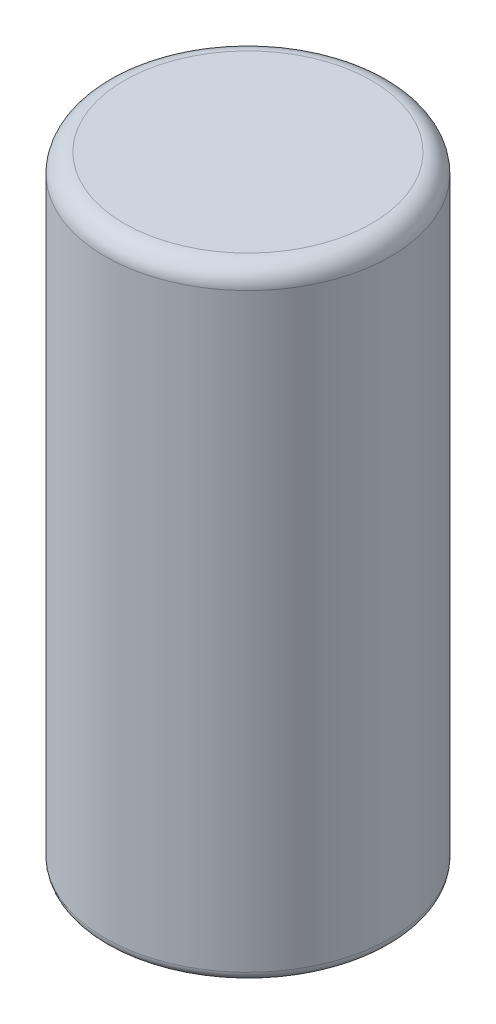
ISO-10303-21;
HEADER;
FILE_DESCRIPTION(('STEP AP214'),'2;1');
FILE_NAME('part.step','',(''),(''),'','','');
FILE_SCHEMA(('AUTOMOTIVE_DESIGN { 1 0 10303 214 1 1 1 1 }'));
ENDSEC;
DATA;
#1=APPLICATION_CONTEXT('core data for automotive mechanical design processes');
#2=APPLICATION_PROTOCOL_DEFINITION('international standard','automotive_design',2000,#1);
#3=PRODUCT_CONTEXT('',#1,'mechanical');
#4=PRODUCT('Part','Part','',(#3));
#5=PRODUCT_RELATED_PRODUCT_CATEGORY('part','',(#4));
#6=PRODUCT_DEFINITION_FORMATION('','',#4);
#7=PRODUCT_DEFINITION_CONTEXT('part definition',#1,'design');
#8=PRODUCT_DEFINITION('design','',#6,#7);
#9=PRODUCT_DEFINITION_SHAPE('','',#8);
#10=(LENGTH_UNIT() NAMED_UNIT(*) SI_UNIT(.MILLI.,.METRE.));
#11=(NAMED_UNIT(*) PLANE_ANGLE_UNIT() SI_UNIT($,.RADIAN.));
#12=(NAMED_UNIT(*) SI_UNIT($,.STERADIAN.) SOLID_ANGLE_UNIT());
#13=UNCERTAINTY_MEASURE_WITH_UNIT(LENGTH_MEASURE(1.E-05),#10,'distance_accuracy_value','');
#14=(GEOMETRIC_REPRESENTATION_CONTEXT(3) GLOBAL_UNCERTAINTY_ASSIGNED_CONTEXT((#13)) GLOBAL_UNIT_ASSIGNED_CONTEXT((#10,
#11,#12)) REPRESENTATION_CONTEXT('',''));
#15=CARTESIAN_POINT('',(0.,0.,0.));
#16=DIRECTION('',(0.,0.,1.));
#17=DIRECTION('',(1.,0.,0.));
#18=AXIS2_PLACEMENT_3D('',#15,#16,#17);
#19=CARTESIAN_POINT('',(0.,65.,0.));
#20=DIRECTION('',(0.,-1.,0.));
#21=DIRECTION('',(0.,0.,-1.));
#22=AXIS2_PLACEMENT_3D('',#19,#20,#21);
#23=CYLINDRICAL_SURFACE('',#22,15.);
#24=CARTESIAN_POINT('',(0.,1.,0.));
#25=DIRECTION('',(0.,1.,0.));
#26=DIRECTION('',(0.,0.,1.));
#27=AXIS2_PLACEMENT_3D('',#24,#25,#26);
#28=CIRCLE('',#27,15.);
#29=CARTESIAN_POINT('',(0.,1.,15.));
#30=VERTEX_POINT('',#29);
#31=EDGE_CURVE('E46',#30,#30,#28,.T.);
#32=ORIENTED_EDGE('',*,*,#31,.T.);
#33=EDGE_LOOP('',(#32));
#34=FACE_BOUND('',#33,.T.);
#35=CARTESIAN_POINT('',(0.,63.,0.));
#36=DIRECTION('',(0.,1.,0.));
#37=DIRECTION('',(0.,0.,1.));
#38=AXIS2_PLACEMENT_3D('',#35,#36,#37);
#39=CIRCLE('',#38,15.);
#40=CARTESIAN_POINT('',(0.,63.,15.));
#41=VERTEX_POINT('',#40);
#42=EDGE_CURVE('E51',#41,#41,#39,.F.);
#43=ORIENTED_EDGE('',*,*,#42,.T.);
#44=EDGE_LOOP('',(#43));
#45=FACE_BOUND('',#44,.T.);
#46=ADVANCED_FACE('F31',(#34,#45),#23,.T.);
#47=CARTESIAN_POINT('',(0.,65.,0.));
#48=DIRECTION('',(0.,1.,0.));
#49=DIRECTION('',(0.,0.,1.));
#50=AXIS2_PLACEMENT_3D('',#47,#48,#49);
#51=PLANE('',#50);
#52=CARTESIAN_POINT('',(0.,65.,0.));
#53=DIRECTION('',(0.,1.,0.));
#54=DIRECTION('',(0.,0.,1.));
#55=AXIS2_PLACEMENT_3D('',#52,#53,#54);
#56=CIRCLE('',#55,13.);
#57=CARTESIAN_POINT('',(0.,65.,13.));
#58=VERTEX_POINT('',#57);
#59=EDGE_CURVE('E54',#58,#58,#56,.T.);
#60=ORIENTED_EDGE('',*,*,#59,.T.);
#61=EDGE_LOOP('',(#60));
#62=FACE_BOUND('',#61,.T.);
#63=ADVANCED_FACE('F79',(#62),#51,.T.);
#64=CARTESIAN_POINT('',(0.,0.,0.));
#65=DIRECTION('',(0.,1.,0.));
#66=DIRECTION('',(0.,0.,1.));
#67=AXIS2_PLACEMENT_3D('',#64,#65,#66);
#68=PLANE('',#67);
#69=CARTESIAN_POINT('',(6.,0.,0.));
#70=DIRECTION('',(0.,1.,0.));
#71=DIRECTION('',(0.,0.,1.));
#72=AXIS2_PLACEMENT_3D('',#69,#70,#71);
#73=CIRCLE('',#72,2.);
#74=CARTESIAN_POINT('',(6.,0.,-2.));
#75=VERTEX_POINT('',#74);
#76=EDGE_CURVE('E10',#75,#75,#73,.F.);
#77=ORIENTED_EDGE('',*,*,#76,.F.);
#78=EDGE_LOOP('',(#77));
#79=FACE_BOUND('',#78,.T.);
#80=CARTESIAN_POINT('',(-6.,0.,0.));
#81=DIRECTION('',(0.,1.,0.));
#82=DIRECTION('',(0.,0.,1.));
#83=AXIS2_PLACEMENT_3D('',#80,#81,#82);
#84=CIRCLE('',#83,2.);
#85=CARTESIAN_POINT('',(-6.,0.,-2.));
#86=VERTEX_POINT('',#85);
#87=EDGE_CURVE('E38',#86,#86,#84,.F.);
#88=ORIENTED_EDGE('',*,*,#87,.F.);
#89=EDGE_LOOP('',(#88));
#90=FACE_BOUND('',#89,.T.);
#91=CARTESIAN_POINT('',(0.,0.,0.));
#92=DIRECTION('',(0.,1.,0.));
#93=DIRECTION('',(0.,0.,1.));
#94=AXIS2_PLACEMENT_3D('',#91,#92,#93);
#95=CIRCLE('',#94,14.);
#96=CARTESIAN_POINT('',(0.,0.,14.));
#97=VERTEX_POINT('',#96);
#98=EDGE_CURVE('E42',#97,#97,#95,.F.);
#99=ORIENTED_EDGE('',*,*,#98,.T.);
#100=EDGE_LOOP('',(#99));
#101=FACE_BOUND('',#100,.T.);
#102=ADVANCED_FACE('F85',(#79,#90,#101),#68,.F.);
#103=CARTESIAN_POINT('',(0.,63.,0.));
#104=DIRECTION('',(0.,1.,0.));
#105=DIRECTION('',(0.,0.,1.));
#106=AXIS2_PLACEMENT_3D('',#103,#104,#105);
#107=TOROIDAL_SURFACE('',#106,13.,2.);
#108=ORIENTED_EDGE('',*,*,#42,.F.);
#109=EDGE_LOOP('',(#108));
#110=FACE_BOUND('',#109,.T.);
#111=ORIENTED_EDGE('',*,*,#59,.F.);
#112=EDGE_LOOP('',(#111));
#113=FACE_BOUND('',#112,.T.);
#114=ADVANCED_FACE('F90',(#110,#113),#107,.T.);
#115=CARTESIAN_POINT('',(0.,1.,0.));
#116=DIRECTION('',(0.,1.,0.));
#117=DIRECTION('',(0.,0.,1.));
#118=AXIS2_PLACEMENT_3D('',#115,#116,#117);
#119=TOROIDAL_SURFACE('',#118,14.,1.);
#120=ORIENTED_EDGE('',*,*,#98,.F.);
#121=EDGE_LOOP('',(#120));
#122=FACE_BOUND('',#121,.T.);
#123=ORIENTED_EDGE('',*,*,#31,.F.);
#124=EDGE_LOOP('',(#123));
#125=FACE_BOUND('',#124,.T.);
#126=ADVANCED_FACE('F33',(#122,#125),#119,.T.);
#127=CARTESIAN_POINT('',(-6.,0.,0.));
#128=DIRECTION('',(0.,1.,0.));
#129=DIRECTION('',(0.,0.,-1.));
#130=AXIS2_PLACEMENT_3D('',#127,#128,#129);
#131=CONICAL_SURFACE('',#130,2.,0.279252680319093);
#132=CARTESIAN_POINT('',(-6.,-5.,0.));
#133=DIRECTION('',(0.,-1.,0.));
#134=DIRECTION('',(0.,0.,-1.));
#135=AXIS2_PLACEMENT_3D('',#132,#133,#134);
#136=CIRCLE('',#135,0.56627307120596);
#137=CARTESIAN_POINT('',(-6.,-5.,-0.56627307120596));
#138=VERTEX_POINT('',#137);
#139=EDGE_CURVE('E57',#138,#138,#136,.T.);
#140=CARTESIAN_POINT('',(-6.,-5.,-0.56627307120596));
#141=CARTESIAN_POINT('',(-6.,-4.94791666666667,-0.581207726714231));
#142=CARTESIAN_POINT('',(-6.,-4.89583333333333,-0.596142382222503));
#143=CARTESIAN_POINT('',(-6.,-4.79166666666667,-0.626011693239045));
#144=CARTESIAN_POINT('',(-6.,-4.73958333333333,-0.640946348747316));
#145=CARTESIAN_POINT('',(-6.,-4.63541666666667,-0.670815659763859));
#146=CARTESIAN_POINT('',(-6.,-4.58333333333333,-0.68575031527213));
#147=CARTESIAN_POINT('',(-6.,-4.47916666666667,-0.715619626288672));
#148=CARTESIAN_POINT('',(-6.,-4.42708333333333,-0.730554281796944));
#149=CARTESIAN_POINT('',(-6.,-4.32291666666667,-0.760423592813486));
#150=CARTESIAN_POINT('',(-6.,-4.27083333333333,-0.775358248321757));
#151=CARTESIAN_POINT('',(-6.,-4.16666666666667,-0.8052275593383));
#152=CARTESIAN_POINT('',(-6.,-4.11458333333333,-0.820162214846571));
#153=CARTESIAN_POINT('',(-6.,-4.01041666666667,-0.850031525863114));
#154=CARTESIAN_POINT('',(-6.,-3.95833333333333,-0.864966181371385));
#155=CARTESIAN_POINT('',(-6.,-3.85416666666667,-0.894835492387927));
#156=CARTESIAN_POINT('',(-6.,-3.80208333333333,-0.909770147896199));
#157=CARTESIAN_POINT('',(-6.,-3.69791666666667,-0.939639458912741));
#158=CARTESIAN_POINT('',(-6.,-3.64583333333333,-0.954574114421012));
#159=CARTESIAN_POINT('',(-6.,-3.54166666666667,-0.984443425437555));
#160=CARTESIAN_POINT('',(-6.,-3.48958333333333,-0.999378080945826));
#161=CARTESIAN_POINT('',(-6.,-3.38541666666667,-1.02924739196237));
#162=CARTESIAN_POINT('',(-6.,-3.33333333333333,-1.04418204747064));
#163=CARTESIAN_POINT('',(-6.,-3.22916666666667,-1.07405135848718));
#164=CARTESIAN_POINT('',(-6.,-3.17708333333333,-1.08898601399545));
#165=CARTESIAN_POINT('',(-6.,-3.07291666666667,-1.118855325012));
#166=CARTESIAN_POINT('',(-6.,-3.02083333333333,-1.13378998052027));
#167=CARTESIAN_POINT('',(-6.,-2.91666666666667,-1.16365929153681));
#168=CARTESIAN_POINT('',(-6.,-2.86458333333333,-1.17859394704508));
#169=CARTESIAN_POINT('',(-6.,-2.76041666666667,-1.20846325806162));
#170=CARTESIAN_POINT('',(-6.,-2.70833333333333,-1.22339791356989));
#171=CARTESIAN_POINT('',(-6.,-2.60416666666667,-1.25326722458644));
#172=CARTESIAN_POINT('',(-6.,-2.55208333333333,-1.26820188009471));
#173=CARTESIAN_POINT('',(-6.,-2.44791666666667,-1.29807119111125));
#174=CARTESIAN_POINT('',(-6.,-2.39583333333333,-1.31300584661952));
#175=CARTESIAN_POINT('',(-6.,-2.29166666666667,-1.34287515763606));
#176=CARTESIAN_POINT('',(-6.,-2.23958333333333,-1.35780981314434));
#177=CARTESIAN_POINT('',(-6.,-2.13541666666667,-1.38767912416088));
#178=CARTESIAN_POINT('',(-6.,-2.08333333333333,-1.40261377966915));
#179=CARTESIAN_POINT('',(-6.,-1.97916666666667,-1.43248309068569));
#180=CARTESIAN_POINT('',(-6.,-1.92708333333333,-1.44741774619396));
#181=CARTESIAN_POINT('',(-6.,-1.82291666666667,-1.47728705721051));
#182=CARTESIAN_POINT('',(-6.,-1.77083333333333,-1.49222171271878));
#183=CARTESIAN_POINT('',(-6.,-1.66666666666667,-1.52209102373532));
#184=CARTESIAN_POINT('',(-6.,-1.61458333333333,-1.53702567924359));
#185=CARTESIAN_POINT('',(-6.,-1.51041666666667,-1.56689499026013));
#186=CARTESIAN_POINT('',(-6.,-1.45833333333333,-1.5818296457684));
#187=CARTESIAN_POINT('',(-6.,-1.35416666666667,-1.61169895678495));
#188=CARTESIAN_POINT('',(-6.,-1.30208333333333,-1.62663361229322));
#189=CARTESIAN_POINT('',(-6.,-1.19791666666667,-1.65650292330976));
#190=CARTESIAN_POINT('',(-6.,-1.14583333333333,-1.67143757881803));
#191=CARTESIAN_POINT('',(-6.,-1.04166666666667,-1.70130688983457));
#192=CARTESIAN_POINT('',(-6.,-0.989583333333333,-1.71624154534285));
#193=CARTESIAN_POINT('',(-6.,-0.885416666666667,-1.74611085635939));
#194=CARTESIAN_POINT('',(-6.,-0.833333333333333,-1.76104551186766));
#195=CARTESIAN_POINT('',(-6.,-0.729166666666667,-1.7909148228842));
#196=CARTESIAN_POINT('',(-6.,-0.677083333333333,-1.80584947839247));
#197=CARTESIAN_POINT('',(-6.,-0.572916666666666,-1.83571878940902));
#198=CARTESIAN_POINT('',(-6.,-0.520833333333333,-1.85065344491729));
#199=CARTESIAN_POINT('',(-6.,-0.416666666666666,-1.88052275593383));
#200=CARTESIAN_POINT('',(-6.,-0.364583333333333,-1.8954574114421));
#201=CARTESIAN_POINT('',(-6.,-0.260416666666667,-1.92532672245864));
#202=CARTESIAN_POINT('',(-6.,-0.208333333333333,-1.94026137796691));
#203=CARTESIAN_POINT('',(-6.,-0.104166666666667,-1.97013068898346));
#204=CARTESIAN_POINT('',(-6.,-0.0520833333333334,-1.98506534449173));
#205=CARTESIAN_POINT('',(-6.,0.,-2.));
#206=B_SPLINE_CURVE_WITH_KNOTS('',3,(#140,#141,#142,#143,#144,#145,#146,#147,#148,#149,#150,
#151,#152,#153,#154,#155,#156,#157,#158,#159,#160,#161,#162,#163,#164,#165,#166,#167,#168,#169,
#170,#171,#172,#173,#174,#175,#176,#177,#178,#179,#180,#181,#182,#183,#184,#185,#186,#187,#188,
#189,#190,#191,#192,#193,#194,#195,#196,#197,#198,#199,#200,#201,#202,#203,#204,#205),
.UNSPECIFIED.,.F.,.F.,(4,2,2,2,2,2,2,2,2,2,2,2,2,2,2,2,2,2,2,2,2,2,2,2,2,2,2,2,2,2,2,2,4),(0.,
0.162546786853376,0.325093573706751,0.487640360560125,0.650187147413501,0.812733934266876,
0.975280721120252,1.13782750797363,1.300374294827,1.46292108168038,1.62546786853375,
1.78801465538713,1.9505614422405,2.11310822909388,2.27565501594725,2.43820180280063,
2.60074858965401,2.76329537650738,2.92584216336075,3.08838895021413,3.25093573706751,
3.41348252392088,3.57602931077426,3.73857609762763,3.90112288448101,4.06366967133438,
4.22621645818776,4.38876324504113,4.55131003189451,4.71385681874788,4.87640360560126,
5.03895039245463,5.20149717930801),.UNSPECIFIED.);
#207=EDGE_CURVE('BSEAM75',#138,#86,#206,.T.);
#208=ORIENTED_EDGE('',*,*,#139,.F.);
#209=ORIENTED_EDGE('',*,*,#87,.T.);
#210=ORIENTED_EDGE('',*,*,#207,.T.);
#211=ORIENTED_EDGE('',*,*,#207,.F.);
#212=EDGE_LOOP('',(#208,#210,#209,#211));
#213=FACE_BOUND('',#212,.T.);
#214=ADVANCED_FACE('F75',(#213),#131,.T.);
#215=CARTESIAN_POINT('',(-6.,-5.,0.));
#216=DIRECTION('',(0.,-1.,0.));
#217=DIRECTION('',(0.,0.,-1.));
#218=AXIS2_PLACEMENT_3D('',#215,#216,#217);
#219=PLANE('',#218);
#220=ORIENTED_EDGE('',*,*,#139,.T.);
#221=EDGE_LOOP('',(#220));
#222=FACE_BOUND('',#221,.T.);
#223=ADVANCED_FACE('F68',(#222),#219,.T.);
#224=CARTESIAN_POINT('',(6.,0.,0.));
#225=DIRECTION('',(0.,1.,0.));
#226=DIRECTION('',(0.,0.,-1.));
#227=AXIS2_PLACEMENT_3D('',#224,#225,#226);
#228=CONICAL_SURFACE('',#227,2.,0.279252680319093);
#229=CARTESIAN_POINT('',(6.,-5.,0.));
#230=DIRECTION('',(0.,-1.,0.));
#231=DIRECTION('',(0.,0.,-1.));
#232=AXIS2_PLACEMENT_3D('',#229,#230,#231);
#233=CIRCLE('',#232,0.566273071205961);
#234=CARTESIAN_POINT('',(6.,-5.,-0.566273071205961));
#235=VERTEX_POINT('',#234);
#236=EDGE_CURVE('E60',#235,#235,#233,.T.);
#237=CARTESIAN_POINT('',(6.,-5.,-0.566273071205961));
#238=CARTESIAN_POINT('',(6.,-4.94791666666667,-0.581207726714232));
#239=CARTESIAN_POINT('',(6.,-4.89583333333333,-0.596142382222503));
#240=CARTESIAN_POINT('',(6.,-4.79166666666667,-0.626011693239046));
#241=CARTESIAN_POINT('',(6.,-4.73958333333333,-0.640946348747317));
#242=CARTESIAN_POINT('',(6.,-4.63541666666667,-0.670815659763859));
#243=CARTESIAN_POINT('',(6.,-4.58333333333333,-0.685750315272131));
#244=CARTESIAN_POINT('',(6.,-4.47916666666667,-0.715619626288673));
#245=CARTESIAN_POINT('',(6.,-4.42708333333333,-0.730554281796944));
#246=CARTESIAN_POINT('',(6.,-4.32291666666667,-0.760423592813487));
#247=CARTESIAN_POINT('',(6.,-4.27083333333333,-0.775358248321758));
#248=CARTESIAN_POINT('',(6.,-4.16666666666667,-0.805227559338301));
#249=CARTESIAN_POINT('',(6.,-4.11458333333333,-0.820162214846572));
#250=CARTESIAN_POINT('',(6.,-4.01041666666667,-0.850031525863115));
#251=CARTESIAN_POINT('',(6.,-3.95833333333333,-0.864966181371386));
#252=CARTESIAN_POINT('',(6.,-3.85416666666667,-0.894835492387928));
#253=CARTESIAN_POINT('',(6.,-3.80208333333333,-0.909770147896199));
#254=CARTESIAN_POINT('',(6.,-3.69791666666667,-0.939639458912742));
#255=CARTESIAN_POINT('',(6.,-3.64583333333333,-0.954574114421013));
#256=CARTESIAN_POINT('',(6.,-3.54166666666667,-0.984443425437556));
#257=CARTESIAN_POINT('',(6.,-3.48958333333333,-0.999378080945827));
#258=CARTESIAN_POINT('',(6.,-3.38541666666667,-1.02924739196237));
#259=CARTESIAN_POINT('',(6.,-3.33333333333333,-1.04418204747064));
#260=CARTESIAN_POINT('',(6.,-3.22916666666667,-1.07405135848718));
#261=CARTESIAN_POINT('',(6.,-3.17708333333333,-1.08898601399545));
#262=CARTESIAN_POINT('',(6.,-3.07291666666667,-1.118855325012));
#263=CARTESIAN_POINT('',(6.,-3.02083333333333,-1.13378998052027));
#264=CARTESIAN_POINT('',(6.,-2.91666666666667,-1.16365929153681));
#265=CARTESIAN_POINT('',(6.,-2.86458333333333,-1.17859394704508));
#266=CARTESIAN_POINT('',(6.,-2.76041666666667,-1.20846325806162));
#267=CARTESIAN_POINT('',(6.,-2.70833333333333,-1.2233979135699));
#268=CARTESIAN_POINT('',(6.,-2.60416666666667,-1.25326722458644));
#269=CARTESIAN_POINT('',(6.,-2.55208333333333,-1.26820188009471));
#270=CARTESIAN_POINT('',(6.,-2.44791666666667,-1.29807119111125));
#271=CARTESIAN_POINT('',(6.,-2.39583333333333,-1.31300584661952));
#272=CARTESIAN_POINT('',(6.,-2.29166666666667,-1.34287515763607));
#273=CARTESIAN_POINT('',(6.,-2.23958333333333,-1.35780981314434));
#274=CARTESIAN_POINT('',(6.,-2.13541666666667,-1.38767912416088));
#275=CARTESIAN_POINT('',(6.,-2.08333333333333,-1.40261377966915));
#276=CARTESIAN_POINT('',(6.,-1.97916666666667,-1.43248309068569));
#277=CARTESIAN_POINT('',(6.,-1.92708333333333,-1.44741774619396));
#278=CARTESIAN_POINT('',(6.,-1.82291666666667,-1.47728705721051));
#279=CARTESIAN_POINT('',(6.,-1.77083333333333,-1.49222171271878));
#280=CARTESIAN_POINT('',(6.,-1.66666666666667,-1.52209102373532));
#281=CARTESIAN_POINT('',(6.,-1.61458333333333,-1.53702567924359));
#282=CARTESIAN_POINT('',(6.,-1.51041666666667,-1.56689499026013));
#283=CARTESIAN_POINT('',(6.,-1.45833333333333,-1.58182964576841));
#284=CARTESIAN_POINT('',(6.,-1.35416666666667,-1.61169895678495));
#285=CARTESIAN_POINT('',(6.,-1.30208333333333,-1.62663361229322));
#286=CARTESIAN_POINT('',(6.,-1.19791666666667,-1.65650292330976));
#287=CARTESIAN_POINT('',(6.,-1.14583333333333,-1.67143757881803));
#288=CARTESIAN_POINT('',(6.,-1.04166666666667,-1.70130688983458));
#289=CARTESIAN_POINT('',(6.,-0.989583333333333,-1.71624154534285));
#290=CARTESIAN_POINT('',(6.,-0.885416666666667,-1.74611085635939));
#291=CARTESIAN_POINT('',(6.,-0.833333333333333,-1.76104551186766));
#292=CARTESIAN_POINT('',(6.,-0.729166666666667,-1.7909148228842));
#293=CARTESIAN_POINT('',(6.,-0.677083333333333,-1.80584947839247));
#294=CARTESIAN_POINT('',(6.,-0.572916666666666,-1.83571878940902));
#295=CARTESIAN_POINT('',(6.,-0.520833333333333,-1.85065344491729));
#296=CARTESIAN_POINT('',(6.,-0.416666666666666,-1.88052275593383));
#297=CARTESIAN_POINT('',(6.,-0.364583333333333,-1.8954574114421));
#298=CARTESIAN_POINT('',(6.,-0.260416666666667,-1.92532672245864));
#299=CARTESIAN_POINT('',(6.,-0.208333333333333,-1.94026137796692));
#300=CARTESIAN_POINT('',(6.,-0.104166666666667,-1.97013068898346));
#301=CARTESIAN_POINT('',(6.,-0.0520833333333334,-1.98506534449173));
#302=CARTESIAN_POINT('',(6.,0.,-2.));
#303=B_SPLINE_CURVE_WITH_KNOTS('',3,(#237,#238,#239,#240,#241,#242,#243,#244,#245,#246,#247,
#248,#249,#250,#251,#252,#253,#254,#255,#256,#257,#258,#259,#260,#261,#262,#263,#264,#265,#266,
#267,#268,#269,#270,#271,#272,#273,#274,#275,#276,#277,#278,#279,#280,#281,#282,#283,#284,#285,
#286,#287,#288,#289,#290,#291,#292,#293,#294,#295,#296,#297,#298,#299,#300,#301,#302),
.UNSPECIFIED.,.F.,.F.,(4,2,2,2,2,2,2,2,2,2,2,2,2,2,2,2,2,2,2,2,2,2,2,2,2,2,2,2,2,2,2,2,4),(0.,
0.162546786853376,0.325093573706751,0.487640360560125,0.650187147413501,0.812733934266876,
0.975280721120252,1.13782750797363,1.300374294827,1.46292108168038,1.62546786853375,
1.78801465538713,1.9505614422405,2.11310822909388,2.27565501594725,2.43820180280063,
2.60074858965401,2.76329537650738,2.92584216336075,3.08838895021413,3.25093573706751,
3.41348252392088,3.57602931077426,3.73857609762763,3.90112288448101,4.06366967133438,
4.22621645818776,4.38876324504113,4.55131003189451,4.71385681874788,4.87640360560126,
5.03895039245463,5.20149717930801),.UNSPECIFIED.);
#304=EDGE_CURVE('BSEAM66',#235,#75,#303,.T.);
#305=ORIENTED_EDGE('',*,*,#236,.F.);
#306=ORIENTED_EDGE('',*,*,#76,.T.);
#307=ORIENTED_EDGE('',*,*,#304,.T.);
#308=ORIENTED_EDGE('',*,*,#304,.F.);
#309=EDGE_LOOP('',(#305,#307,#306,#308));
#310=FACE_BOUND('',#309,.T.);
#311=ADVANCED_FACE('F66',(#310),#228,.T.);
#312=CARTESIAN_POINT('',(6.,-5.,0.));
#313=DIRECTION('',(0.,-1.,0.));
#314=DIRECTION('',(0.,0.,-1.));
#315=AXIS2_PLACEMENT_3D('',#312,#313,#314);
#316=PLANE('',#315);
#317=ORIENTED_EDGE('',*,*,#236,.T.);
#318=EDGE_LOOP('',(#317));
#319=FACE_BOUND('',#318,.T.);
#320=ADVANCED_FACE('F64',(#319),#316,.T.);
#321=CLOSED_SHELL('',(#46,#63,#102,#114,#126,#214,#223,#311,#320));
#322=MANIFOLD_SOLID_BREP('B2',#321);
#323=ADVANCED_BREP_SHAPE_REPRESENTATION('',(#18,#322),#14);
#324=SHAPE_DEFINITION_REPRESENTATION(#9,#323);
ENDSEC;
END-ISO-10303-21;
